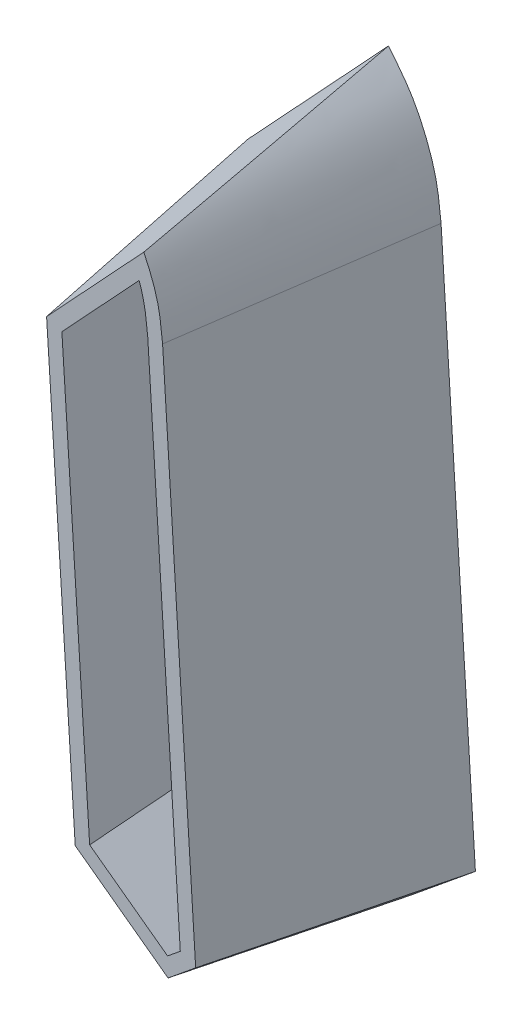
ISO-10303-21;
HEADER;
FILE_DESCRIPTION(('STEP AP214'),'2;1');
FILE_NAME('part.step','',(''),(''),'','','');
FILE_SCHEMA(('AUTOMOTIVE_DESIGN { 1 0 10303 214 1 1 1 1 }'));
ENDSEC;
DATA;
#1=APPLICATION_CONTEXT('core data for automotive mechanical design processes');
#2=APPLICATION_PROTOCOL_DEFINITION('international standard','automotive_design',2000,#1);
#3=PRODUCT_CONTEXT('',#1,'mechanical');
#4=PRODUCT('Part','Part','',(#3));
#5=PRODUCT_RELATED_PRODUCT_CATEGORY('part','',(#4));
#6=PRODUCT_DEFINITION_FORMATION('','',#4);
#7=PRODUCT_DEFINITION_CONTEXT('part definition',#1,'design');
#8=PRODUCT_DEFINITION('design','',#6,#7);
#9=PRODUCT_DEFINITION_SHAPE('','',#8);
#10=(LENGTH_UNIT() NAMED_UNIT(*) SI_UNIT(.MILLI.,.METRE.));
#11=(NAMED_UNIT(*) PLANE_ANGLE_UNIT() SI_UNIT($,.RADIAN.));
#12=(NAMED_UNIT(*) SI_UNIT($,.STERADIAN.) SOLID_ANGLE_UNIT());
#13=UNCERTAINTY_MEASURE_WITH_UNIT(LENGTH_MEASURE(1.E-05),#10,'distance_accuracy_value','');
#14=(GEOMETRIC_REPRESENTATION_CONTEXT(3) GLOBAL_UNCERTAINTY_ASSIGNED_CONTEXT((#13)) GLOBAL_UNIT_ASSIGNED_CONTEXT((#10,
#11,#12)) REPRESENTATION_CONTEXT('',''));
#15=CARTESIAN_POINT('',(0.,0.,0.));
#16=DIRECTION('',(0.,0.,1.));
#17=DIRECTION('',(1.,0.,0.));
#18=AXIS2_PLACEMENT_3D('',#15,#16,#17);
#19=CARTESIAN_POINT('',(3.87227801463903,18.4236879015267,14.6));
#20=DIRECTION('',(0.,0.,1.));
#21=DIRECTION('',(1.,0.,0.));
#22=AXIS2_PLACEMENT_3D('',#19,#20,#21);
#23=PLANE('',#22);
#24=DIRECTION('',(0.064382277997965,-0.997925308968458,0.));
#25=VECTOR('',#24,1.);
#26=CARTESIAN_POINT('',(-3.66355411317834,12.6296977708703,14.6));
#27=LINE('',#26,#25);
#28=CARTESIAN_POINT('',(-3.60200706317457,11.6757184958119,14.6));
#29=VERTEX_POINT('',#28);
#30=CARTESIAN_POINT('',(-1.91571842345979,-14.4617554197673,14.6));
#31=VERTEX_POINT('',#30);
#32=EDGE_CURVE('E436',#29,#31,#27,.T.);
#33=ORIENTED_EDGE('',*,*,#32,.F.);
#34=DIRECTION('',(-0.68139186174768,-0.731918800649383,0.));
#35=VECTOR('',#34,1.);
#36=CARTESIAN_POINT('',(3.18660885292075,18.9677275412879,14.6));
#37=LINE('',#36,#35);
#38=CARTESIAN_POINT('',(1.08544398610209,16.7107559576479,14.6));
#39=VERTEX_POINT('',#38);
#40=EDGE_CURVE('E459',#39,#29,#37,.T.);
#41=ORIENTED_EDGE('',*,*,#40,.F.);
#42=CARTESIAN_POINT('',(1.61023609440265,14.0146809414128,14.6));
#43=CARTESIAN_POINT('',(1.60071312676498,14.106316072458,14.6));
#44=CARTESIAN_POINT('',(1.59121125163537,14.1979552210391,14.6));
#45=CARTESIAN_POINT('',(1.57181162621345,14.3810119738376,14.6));
#46=CARTESIAN_POINT('',(1.56191467738446,14.4724296636665,14.6));
#47=CARTESIAN_POINT('',(1.54127376841198,14.6549898517129,14.6));
#48=CARTESIAN_POINT('',(1.53053150603807,14.7461325381527,14.6));
#49=CARTESIAN_POINT('',(1.50768052696685,14.9280793157177,14.6));
#50=CARTESIAN_POINT('',(1.49557434957431,15.0188837212538,14.6));
#51=CARTESIAN_POINT('',(1.46941341645522,15.200085398456,14.6));
#52=CARTESIAN_POINT('',(1.45536145648558,15.2904830654821,14.6));
#53=CARTESIAN_POINT('',(1.43236009956773,15.4258640302481,14.6));
#54=CARTESIAN_POINT('',(1.42436172237702,15.4710087934331,14.6));
#55=CARTESIAN_POINT('',(1.40750939628041,15.5611388636403,14.6));
#56=CARTESIAN_POINT('',(1.39865545765002,15.6061241725708,14.6));
#57=CARTESIAN_POINT('',(1.38007750028059,15.6959017382836,14.6));
#58=CARTESIAN_POINT('',(1.37035372146911,15.7406940447507,14.6));
#59=CARTESIAN_POINT('',(1.35002950680315,15.8300796558035,14.6));
#60=CARTESIAN_POINT('',(1.33942906500428,15.8746729590377,14.6));
#61=CARTESIAN_POINT('',(1.31733514430271,15.9636943205373,14.6));
#62=CARTESIAN_POINT('',(1.30584062155508,16.0081221202181,14.6));
#63=CARTESIAN_POINT('',(1.28193829721659,16.0967305869205,14.6));
#64=CARTESIAN_POINT('',(1.26953049689792,16.1409112542862,14.6));
#65=CARTESIAN_POINT('',(1.23108905171449,16.2733451786891,14.6));
#66=CARTESIAN_POINT('',(1.20389507601611,16.3612620596593,14.6));
#67=CARTESIAN_POINT('',(1.14668358142519,16.536520698584,14.6));
#68=CARTESIAN_POINT('',(1.1166563545105,16.6238592944872,14.6));
#69=CARTESIAN_POINT('',(1.08544398610209,16.7107559576479,14.6));
#70=B_SPLINE_CURVE_WITH_KNOTS('',3,(#42,#43,#44,#45,#46,#47,#48,#49,#50,#51,#52,#53,#54,#55,#56,
#57,#58,#59,#60,#61,#62,#63,#64,#65,#66,#67,#68,#69),.UNSPECIFIED.,.F.,.F.,(4,2,2,2,2,2,2,2,2,2,
2,2,2,4),(0.,0.276388968885837,0.552243209624812,0.827556898351419,1.10236623061239,
1.37678472873674,1.51432234685472,1.65185831331688,1.78935645959755,1.92685553828804,
2.06451762964606,2.20217952924483,2.47820933218736,2.75522189085504),.UNSPECIFIED.);
#71=CARTESIAN_POINT('',(1.61023609440265,14.0146809414128,14.6));
#72=VERTEX_POINT('',#71);
#73=EDGE_CURVE('E479',#72,#39,#70,.T.);
#74=ORIENTED_EDGE('',*,*,#73,.F.);
#75=DIRECTION('',(-0.0629956112398931,0.998013803994971,0.));
#76=VECTOR('',#75,1.);
#77=CARTESIAN_POINT('',(3.65870460275384,-18.438371075151,14.6));
#78=LINE('',#77,#76);
#79=CARTESIAN_POINT('',(3.58703567302214,-17.3029494198645,14.6));
#80=VERTEX_POINT('',#79);
#81=EDGE_CURVE('E487',#80,#72,#78,.T.);
#82=ORIENTED_EDGE('',*,*,#81,.F.);
#83=DIRECTION('',(0.773957299203321,0.633237790257262,0.));
#84=VECTOR('',#83,1.);
#85=CARTESIAN_POINT('',(1.4834286614798,-19.0240824293082,14.6));
#86=LINE('',#85,#84);
#87=CARTESIAN_POINT('',(2.81418728161062,-17.9352799219284,14.6));
#88=VERTEX_POINT('',#87);
#89=EDGE_CURVE('E815',#88,#80,#86,.T.);
#90=ORIENTED_EDGE('',*,*,#89,.F.);
#91=DIRECTION('',(0.806004429494522,-0.591909502910039,0.));
#92=VECTOR('',#91,1.);
#93=CARTESIAN_POINT('',(-2.74941625034012,-13.8495085781521,14.6));
#94=LINE('',#93,#92);
#95=EDGE_CURVE('E467',#31,#88,#94,.T.);
#96=ORIENTED_EDGE('',*,*,#95,.F.);
#97=EDGE_LOOP('',(#33,#41,#74,#82,#90,#96));
#98=FACE_BOUND('',#97,.T.);
#99=DIRECTION('',(0.68139186174768,0.731918800649383,0.));
#100=VECTOR('',#99,1.);
#101=CARTESIAN_POINT('',(2.57127209480842,19.6348807894148,14.6));
#102=LINE('',#101,#100);
#103=CARTESIAN_POINT('',(1.37023439181418,18.3447830872562,14.6));
#104=VERTEX_POINT('',#103);
#105=CARTESIAN_POINT('',(-4.53021776365667,12.0067974032997,14.6));
#106=VERTEX_POINT('',#105);
#107=EDGE_CURVE('E311',#104,#106,#102,.F.);
#108=ORIENTED_EDGE('',*,*,#107,.T.);
#109=DIRECTION('',(-0.064382277997965,0.997925308968458,0.));
#110=VECTOR('',#109,1.);
#111=CARTESIAN_POINT('',(-4.90766566808868,17.8572399219959,14.6));
#112=LINE('',#111,#110);
#113=CARTESIAN_POINT('',(-2.79163138895931,-14.9412914045093,14.6));
#114=VERTEX_POINT('',#113);
#115=EDGE_CURVE('E12',#106,#114,#112,.F.);
#116=ORIENTED_EDGE('',*,*,#115,.T.);
#117=DIRECTION('',(-0.806004429494522,0.591909502910039,0.));
#118=VECTOR('',#117,1.);
#119=CARTESIAN_POINT('',(-14.380288777606,-6.43087113472187,14.6));
#120=LINE('',#119,#118);
#121=CARTESIAN_POINT('',(2.84413205824944,-19.0800551860532,14.6));
#122=VERTEX_POINT('',#121);
#123=EDGE_CURVE('E199',#114,#122,#120,.F.);
#124=ORIENTED_EDGE('',*,*,#123,.T.);
#125=DIRECTION('',(-0.773957299203321,-0.633237790257262,0.));
#126=VECTOR('',#125,1.);
#127=CARTESIAN_POINT('',(21.8405490205937,-3.53753221686241,14.6));
#128=LINE('',#127,#126);
#129=CARTESIAN_POINT('',(4.51945745204866,-17.7093344093084,14.6));
#130=VERTEX_POINT('',#129);
#131=EDGE_CURVE('E821',#122,#130,#128,.F.);
#132=ORIENTED_EDGE('',*,*,#131,.T.);
#133=DIRECTION('',(0.062995611239893,-0.998013803994971,0.));
#134=VECTOR('',#133,1.);
#135=CARTESIAN_POINT('',(2.24518835101128,18.3209844043485,14.6));
#136=LINE('',#135,#134);
#137=CARTESIAN_POINT('',(2.51226233026394,14.0898401589662,14.6));
#138=VERTEX_POINT('',#137);
#139=EDGE_CURVE('E371',#130,#138,#136,.F.);
#140=ORIENTED_EDGE('',*,*,#139,.T.);
#141=CARTESIAN_POINT('',(2.51706792493701,14.0435144950325,14.6));
#142=CARTESIAN_POINT('',(2.50515186986557,14.1580651651376,14.6));
#143=CARTESIAN_POINT('',(2.49329247703641,14.2726258792983,14.6));
#144=CARTESIAN_POINT('',(2.46888953291516,14.5019561791502,14.6));
#145=CARTESIAN_POINT('',(2.45634438394057,14.6167255930305,14.6));
#146=CARTESIAN_POINT('',(2.42981079843857,14.8462085220989,14.6));
#147=CARTESIAN_POINT('',(2.41582103928684,14.9609218876986,14.6));
#148=CARTESIAN_POINT('',(2.38540102477533,15.1901955886822,14.6));
#149=CARTESIAN_POINT('',(2.36896743058682,15.304755494896,14.6));
#150=CARTESIAN_POINT('',(2.34172811727021,15.4761359156283,14.6));
#151=CARTESIAN_POINT('',(2.33222132132884,15.533162680889,14.6));
#152=CARTESIAN_POINT('',(2.31218610706565,15.6470367044503,14.6));
#153=CARTESIAN_POINT('',(2.30165770119421,15.7038839649298,14.6));
#154=CARTESIAN_POINT('',(2.27944530321414,15.8173202133363,14.6));
#155=CARTESIAN_POINT('',(2.26776197435318,15.8739093301981,14.6));
#156=CARTESIAN_POINT('',(2.24302433150095,15.9867874459897,14.6));
#157=CARTESIAN_POINT('',(2.22997001740809,16.0430764448972,14.6));
#158=CARTESIAN_POINT('',(2.19879585738584,16.1708234987215,14.6));
#159=CARTESIAN_POINT('',(2.18027198755842,16.2421830369884,14.6));
#160=CARTESIAN_POINT('',(2.14133155954117,16.384384118774,14.6));
#161=CARTESIAN_POINT('',(2.1209149027198,16.4552256350911,14.6));
#162=CARTESIAN_POINT('',(2.05705188579153,16.6670249880346,14.6));
#163=CARTESIAN_POINT('',(2.01100537619171,16.8072057914651,14.6));
#164=CARTESIAN_POINT('',(1.93769979178003,17.0158385751609,14.6));
#165=CARTESIAN_POINT('',(1.91257903865408,17.0850584953647,14.6));
#166=CARTESIAN_POINT('',(1.86103848686555,17.2230161327681,14.6));
#167=CARTESIAN_POINT('',(1.83461866771627,17.2917538423435,14.6));
#168=CARTESIAN_POINT('',(1.78059908969113,17.428795236173,14.6));
#169=CARTESIAN_POINT('',(1.75299885016974,17.4970987303665,14.6));
#170=CARTESIAN_POINT('',(1.69674284942329,17.6332682695026,14.6));
#171=CARTESIAN_POINT('',(1.66808709886712,17.7011343188586,14.6));
#172=CARTESIAN_POINT('',(1.59075132807518,17.8799255351254,14.6));
#173=CARTESIAN_POINT('',(1.54106589484465,17.9904194514132,14.6));
#174=CARTESIAN_POINT('',(1.43790642702302,18.2096351833521,14.6));
#175=CARTESIAN_POINT('',(1.38443235145378,18.3183569798202,14.6));
#176=CARTESIAN_POINT('',(1.27310543768194,18.5334266181351,14.6));
#177=CARTESIAN_POINT('',(1.21525638208929,18.6397764100765,14.6));
#178=CARTESIAN_POINT('',(1.09469826470812,18.8495706779165,14.6));
#179=CARTESIAN_POINT('',(1.03199394502238,18.9530178575006,14.6));
#180=CARTESIAN_POINT('',(0.900996317867633,19.1564831667151,14.6));
#181=CARTESIAN_POINT('',(0.832696095620921,19.2564968303913,14.6));
#182=CARTESIAN_POINT('',(0.692297078183861,19.4539315799896,14.6));
#183=CARTESIAN_POINT('',(0.620194664806909,19.5513500586543,14.6));
#184=CARTESIAN_POINT('',(0.473349392524603,19.7442887770781,14.6));
#185=CARTESIAN_POINT('',(0.398604459436016,19.8398074294114,14.6));
#186=CARTESIAN_POINT('',(0.247558334550347,20.0295570500392,14.6));
#187=CARTESIAN_POINT('',(0.171257548957128,20.1237883439759,14.6));
#188=CARTESIAN_POINT('',(0.0730233812226095,20.2440987049029,14.6));
#189=CARTESIAN_POINT('',(0.0514426639616871,20.2704673906331,14.6));
#190=CARTESIAN_POINT('',(0.00823909471218009,20.3231586276142,14.6));
#191=CARTESIAN_POINT('',(-0.0133837446531021,20.3494811892043,14.6));
#192=CARTESIAN_POINT('',(-0.0782458829553675,20.4283356712043,14.6));
#193=CARTESIAN_POINT('',(-0.121536757301503,20.4808252238813,14.6));
#194=CARTESIAN_POINT('',(-0.164843457964213,20.5333013140376,14.6));
#195=B_SPLINE_CURVE_WITH_KNOTS('',3,(#141,#142,#143,#144,#145,#146,#147,#148,#149,#150,#151,
#152,#153,#154,#155,#156,#157,#158,#159,#160,#161,#162,#163,#164,#165,#166,#167,#168,#169,#170,
#171,#172,#173,#174,#175,#176,#177,#178,#179,#180,#181,#182,#183,#184,#185,#186,#187,#188,#189,
#190,#191,#192,#193,#194),.UNSPECIFIED.,.F.,.F.,(4,2,2,2,2,2,2,2,2,2,2,2,2,2,2,2,2,2,2,2,2,2,2,
2,2,2,4),(0.,0.345513524648036,0.691869518593735,1.03854548142292,1.38569950866771,
1.55913325661909,1.73256489119701,1.90589749998887,2.07923012162375,2.30037315799642,
2.52152772443248,2.96399692925322,3.18490062737779,3.40580781034569,3.62680581538108,
3.84780158722746,4.21119248469657,4.57458731321939,4.93767146542055,5.30040536364695,
5.66359445010276,6.02713561544649,6.39096876162207,6.75470810413941,6.8569300471466,
6.95912501187838,7.16324037384047),.UNSPECIFIED.);
#196=EDGE_CURVE('E362',#138,#104,#195,.T.);
#197=ORIENTED_EDGE('',*,*,#196,.T.);
#198=EDGE_LOOP('',(#108,#116,#124,#132,#140,#197));
#199=FACE_BOUND('',#198,.T.);
#200=ADVANCED_FACE('F190',(#98,#199),#23,.T.);
#201=CARTESIAN_POINT('',(3.87539249217648,18.4158054949753,0.));
#202=DIRECTION('',(0.,0.,1.));
#203=DIRECTION('',(1.,0.,0.));
#204=AXIS2_PLACEMENT_3D('',#201,#202,#203);
#205=PLANE('',#204);
#206=DIRECTION('',(-0.68139186174768,-0.731918800649383,0.));
#207=VECTOR('',#206,1.);
#208=CARTESIAN_POINT('',(1.61860283110759,22.0052294456083,0.));
#209=LINE('',#208,#207);
#210=CARTESIAN_POINT('',(1.61860283110759,22.0052294456083,0.));
#211=VERTEX_POINT('',#210);
#212=CARTESIAN_POINT('',(-6.9020178309561,12.8527830988461,0.));
#213=VERTEX_POINT('',#212);
#214=EDGE_CURVE('E308',#211,#213,#209,.T.);
#215=ORIENTED_EDGE('',*,*,#214,.F.);
#216=CARTESIAN_POINT('',(4.8171445311525,14.2820531628694,0.));
#217=CARTESIAN_POINT('',(4.74365145263784,14.9907001597826,0.));
#218=CARTESIAN_POINT('',(4.6709877959634,15.699468232885,0.));
#219=CARTESIAN_POINT('',(4.44510836229876,16.745558019847,0.));
#220=CARTESIAN_POINT('',(4.35014492308384,17.0887509553164,0.));
#221=CARTESIAN_POINT('',(4.13222880477891,17.7606046441232,0.));
#222=CARTESIAN_POINT('',(4.00900621810086,18.0904281051886,0.));
#223=CARTESIAN_POINT('',(3.60816504032774,19.0665602745486,0.));
#224=CARTESIAN_POINT('',(3.30047745141903,19.7000033187042,0.));
#225=CARTESIAN_POINT('',(2.72213163531692,20.6001863302646,0.));
#226=CARTESIAN_POINT('',(2.510782441825,20.8897127338198,0.));
#227=CARTESIAN_POINT('',(2.07307494793187,21.4539344824473,0.));
#228=CARTESIAN_POINT('',(1.84599992817952,21.7297061369493,0.));
#229=CARTESIAN_POINT('',(1.61860283110759,22.0052294456083,0.));
#230=B_SPLINE_CURVE_WITH_KNOTS('',3,(#216,#217,#218,#219,#220,#221,#222,#223,#224,#225,#226,
#227,#228,#229),.UNSPECIFIED.,.F.,.F.,(4,2,2,2,2,2,4),(0.,0.249999999999999,0.374999999999999,
0.499999999999999,0.749999999999999,0.875,1.),.UNSPECIFIED.);
#231=CARTESIAN_POINT('',(4.8171445311525,14.2820531628694,0.));
#232=VERTEX_POINT('',#231);
#233=EDGE_CURVE('E319',#232,#211,#230,.T.);
#234=ORIENTED_EDGE('',*,*,#233,.F.);
#235=DIRECTION('',(-0.062995611239893,0.998013803994971,0.));
#236=VECTOR('',#235,1.);
#237=CARTESIAN_POINT('',(6.9020178309561,-18.7477451330933,0.));
#238=LINE('',#237,#236);
#239=CARTESIAN_POINT('',(6.9020178309561,-18.7477451330933,0.));
#240=VERTEX_POINT('',#239);
#241=EDGE_CURVE('E325',#240,#232,#238,.T.);
#242=ORIENTED_EDGE('',*,*,#241,.F.);
#243=DIRECTION('',(0.773957299203321,0.633237790257263,0.));
#244=VECTOR('',#243,1.);
#245=CARTESIAN_POINT('',(2.92064811566004,-22.0052294456083,0.));
#246=LINE('',#245,#244);
#247=CARTESIAN_POINT('',(2.92064811566004,-22.0052294456083,0.));
#248=VERTEX_POINT('',#247);
#249=EDGE_CURVE('E349',#248,#240,#246,.T.);
#250=ORIENTED_EDGE('',*,*,#249,.F.);
#251=DIRECTION('',(0.806004429494522,-0.591909502910039,0.));
#252=VECTOR('',#251,1.);
#253=CARTESIAN_POINT('',(-5.02546933728896,-16.1697994410989,0.));
#254=LINE('',#253,#252);
#255=CARTESIAN_POINT('',(-5.02546933728896,-16.1697994410989,0.));
#256=VERTEX_POINT('',#255);
#257=EDGE_CURVE('E345',#256,#248,#254,.T.);
#258=ORIENTED_EDGE('',*,*,#257,.F.);
#259=DIRECTION('',(0.0764088745643058,-0.99707656871868,0.));
#260=VECTOR('',#259,1.);
#261=CARTESIAN_POINT('',(-5.05155051671999,-15.8294602718137,0.));
#262=LINE('',#261,#260);
#263=CARTESIAN_POINT('',(-5.05155051671999,-15.8294602718137,0.));
#264=VERTEX_POINT('',#263);
#265=EDGE_CURVE('E336',#264,#256,#262,.T.);
#266=ORIENTED_EDGE('',*,*,#265,.F.);
#267=DIRECTION('',(0.064382277997965,-0.997925308968458,0.));
#268=VECTOR('',#267,1.);
#269=CARTESIAN_POINT('',(-6.9020178309561,12.8527830988461,0.));
#270=LINE('',#269,#268);
#271=EDGE_CURVE('E330',#213,#264,#270,.T.);
#272=ORIENTED_EDGE('',*,*,#271,.F.);
#273=EDGE_LOOP('',(#215,#234,#242,#250,#258,#266,#272));
#274=FACE_BOUND('',#273,.T.);
#275=DIRECTION('',(-0.68139186174768,-0.731918800649383,0.));
#276=VECTOR('',#275,1.);
#277=CARTESIAN_POINT('',(2.35052163175697,21.3238375838606,0.));
#278=LINE('',#277,#276);
#279=CARTESIAN_POINT('',(1.56366515846673,20.4786337025923,0.));
#280=VERTEX_POINT('',#279);
#281=CARTESIAN_POINT('',(-5.87633589483157,12.4869376559249,0.));
#282=VERTEX_POINT('',#281);
#283=EDGE_CURVE('E214',#280,#282,#278,.T.);
#284=ORIENTED_EDGE('',*,*,#283,.T.);
#285=DIRECTION('',(0.064382277997965,-0.997925308968458,0.));
#286=VECTOR('',#285,1.);
#287=CARTESIAN_POINT('',(-5.90409252198765,12.9171653768441,0.));
#288=LINE('',#287,#286);
#289=CARTESIAN_POINT('',(-4.06190582511666,-15.6367284246563,0.));
#290=VERTEX_POINT('',#289);
#291=EDGE_CURVE('E803',#282,#290,#288,.T.);
#292=ORIENTED_EDGE('',*,*,#291,.T.);
#293=DIRECTION('',(0.806004429494522,-0.591909502910039,0.));
#294=VECTOR('',#293,1.);
#295=CARTESIAN_POINT('',(-4.43355983437892,-15.3637950116043,0.));
#296=LINE('',#295,#294);
#297=CARTESIAN_POINT('',(2.88755884351119,-20.7402415406799,0.));
#298=VERTEX_POINT('',#297);
#299=EDGE_CURVE('E801',#290,#298,#296,.T.);
#300=ORIENTED_EDGE('',*,*,#299,.T.);
#301=DIRECTION('',(0.773957299203321,0.633237790257263,0.));
#302=VECTOR('',#301,1.);
#303=CARTESIAN_POINT('',(2.28741032540278,-21.231272146405,0.));
#304=LINE('',#303,#302);
#305=CARTESIAN_POINT('',(5.87168261170051,-18.2986857303432,0.));
#306=VERTEX_POINT('',#305);
#307=EDGE_CURVE('E778',#298,#306,#304,.T.);
#308=ORIENTED_EDGE('',*,*,#307,.T.);
#309=DIRECTION('',(-0.062995611239893,0.998013803994971,0.));
#310=VECTOR('',#309,1.);
#311=CARTESIAN_POINT('',(5.90400402696113,-18.8107407443332,0.));
#312=LINE('',#311,#310);
#313=CARTESIAN_POINT('',(3.82040008561638,14.1989476227119,0.));
#314=VERTEX_POINT('',#313);
#315=EDGE_CURVE('E793',#306,#314,#312,.T.);
#316=ORIENTED_EDGE('',*,*,#315,.T.);
#317=CARTESIAN_POINT('',(3.82040008561638,14.1989476227119,0.));
#318=CARTESIAN_POINT('',(3.76214796775195,14.7607027667106,0.));
#319=CARTESIAN_POINT('',(3.7049128716537,15.3226101346021,0.));
#320=CARTESIAN_POINT('',(3.55347880581369,16.1556552123493,0.));
#321=CARTESIAN_POINT('',(3.49023588310681,16.4322509478892,0.));
#322=CARTESIAN_POINT('',(3.33837307565681,16.9766335877023,0.));
#323=CARTESIAN_POINT('',(3.25085193640039,17.2446989813618,0.));
#324=CARTESIAN_POINT('',(3.05809943480658,17.7745249592178,0.));
#325=CARTESIAN_POINT('',(2.95314281756539,18.0363833522038,0.));
#326=CARTESIAN_POINT('',(2.72860719194208,18.5548945916611,0.));
#327=CARTESIAN_POINT('',(2.60822289993793,18.8110971957428,0.));
#328=CARTESIAN_POINT('',(2.34764087823596,19.3102691844403,0.));
#329=CARTESIAN_POINT('',(2.20721867572475,19.5537724077982,0.));
#330=CARTESIAN_POINT('',(1.90110045311865,20.0256044456607,0.));
#331=CARTESIAN_POINT('',(1.73565253247487,20.2540822191619,0.));
#332=CARTESIAN_POINT('',(1.56366515846673,20.4786337025923,0.));
#333=B_SPLINE_CURVE_WITH_KNOTS('',3,(#317,#318,#319,#320,#321,#322,#323,#324,#325,#326,#327,
#328,#329,#330,#331,#332),.UNSPECIFIED.,.F.,.F.,(4,2,2,2,2,2,2,4),(0.,0.249999999999998,
0.374999999999999,0.499999999999999,0.624999999999999,0.749999999999999,0.875,1.),.UNSPECIFIED.);
#334=EDGE_CURVE('E547',#314,#280,#333,.T.);
#335=ORIENTED_EDGE('',*,*,#334,.T.);
#336=EDGE_LOOP('',(#284,#292,#300,#308,#316,#335));
#337=FACE_BOUND('',#336,.T.);
#338=ADVANCED_FACE('F192',(#274,#337),#205,.F.);
#339=CARTESIAN_POINT('',(2.35052163175697,21.3238375838606,0.6));
#340=DIRECTION('',(0.731918800649383,-0.68139186174768,0.));
#341=DIRECTION('',(0.68139186174768,0.731918800649383,0.));
#342=AXIS2_PLACEMENT_3D('',#339,#340,#341);
#343=PLANE('',#342);
#344=ORIENTED_EDGE('',*,*,#283,.F.);
#345=DIRECTION('',(0.,0.,-1.));
#346=VECTOR('',#345,1.);
#347=CARTESIAN_POINT('',(1.56366515846673,20.4786337025923,0.6));
#348=LINE('',#347,#346);
#349=CARTESIAN_POINT('',(1.56366515846673,20.4786337025923,0.6));
#350=VERTEX_POINT('',#349);
#351=EDGE_CURVE('E541',#350,#280,#348,.T.);
#352=ORIENTED_EDGE('',*,*,#351,.F.);
#353=DIRECTION('',(-0.68139186174768,-0.731918800649383,0.));
#354=VECTOR('',#353,1.);
#355=CARTESIAN_POINT('',(2.35052163175697,21.3238375838606,0.6));
#356=LINE('',#355,#354);
#357=CARTESIAN_POINT('',(-5.87633589483157,12.4869376559249,0.6));
#358=VERTEX_POINT('',#357);
#359=EDGE_CURVE('E792',#350,#358,#356,.T.);
#360=ORIENTED_EDGE('',*,*,#359,.T.);
#361=DIRECTION('',(0.,0.,-1.));
#362=VECTOR('',#361,1.);
#363=CARTESIAN_POINT('',(-5.87633589483157,12.4869376559249,0.6));
#364=LINE('',#363,#362);
#365=EDGE_CURVE('E332',#358,#282,#364,.T.);
#366=ORIENTED_EDGE('',*,*,#365,.T.);
#367=EDGE_LOOP('',(#344,#352,#360,#366));
#368=FACE_BOUND('',#367,.T.);
#369=ADVANCED_FACE('F431',(#368),#343,.T.);
#370=CARTESIAN_POINT('',(-5.90409252198765,12.9171653768441,0.6));
#371=DIRECTION('',(0.997925308968458,0.064382277997965,0.));
#372=DIRECTION('',(-0.064382277997965,0.997925308968458,0.));
#373=AXIS2_PLACEMENT_3D('',#370,#371,#372);
#374=PLANE('',#373);
#375=ORIENTED_EDGE('',*,*,#291,.F.);
#376=ORIENTED_EDGE('',*,*,#365,.F.);
#377=DIRECTION('',(0.064382277997965,-0.997925308968458,0.));
#378=VECTOR('',#377,1.);
#379=CARTESIAN_POINT('',(-5.90409252198765,12.9171653768441,0.6));
#380=LINE('',#379,#378);
#381=CARTESIAN_POINT('',(-4.06190582511666,-15.6367284246563,0.6));
#382=VERTEX_POINT('',#381);
#383=EDGE_CURVE('E776',#358,#382,#380,.T.);
#384=ORIENTED_EDGE('',*,*,#383,.T.);
#385=DIRECTION('',(0.,0.,-1.));
#386=VECTOR('',#385,1.);
#387=CARTESIAN_POINT('',(-4.06190582511666,-15.6367284246563,0.6));
#388=LINE('',#387,#386);
#389=EDGE_CURVE('E338',#382,#290,#388,.T.);
#390=ORIENTED_EDGE('',*,*,#389,.T.);
#391=EDGE_LOOP('',(#375,#376,#384,#390));
#392=FACE_BOUND('',#391,.T.);
#393=ADVANCED_FACE('F586',(#392),#374,.T.);
#394=CARTESIAN_POINT('',(-4.43355983437892,-15.3637950116043,0.6));
#395=DIRECTION('',(0.591909502910039,0.806004429494522,0.));
#396=DIRECTION('',(-0.806004429494523,0.591909502910039,0.));
#397=AXIS2_PLACEMENT_3D('',#394,#395,#396);
#398=PLANE('',#397);
#399=ORIENTED_EDGE('',*,*,#299,.F.);
#400=ORIENTED_EDGE('',*,*,#389,.F.);
#401=DIRECTION('',(0.806004429494522,-0.591909502910039,0.));
#402=VECTOR('',#401,1.);
#403=CARTESIAN_POINT('',(-4.43355983437892,-15.3637950116043,0.6));
#404=LINE('',#403,#402);
#405=CARTESIAN_POINT('',(2.88755884351119,-20.7402415406799,0.6));
#406=VERTEX_POINT('',#405);
#407=EDGE_CURVE('E560',#382,#406,#404,.T.);
#408=ORIENTED_EDGE('',*,*,#407,.T.);
#409=DIRECTION('',(0.,0.,-1.));
#410=VECTOR('',#409,1.);
#411=CARTESIAN_POINT('',(2.88755884351119,-20.7402415406799,0.6));
#412=LINE('',#411,#410);
#413=EDGE_CURVE('E771',#406,#298,#412,.T.);
#414=ORIENTED_EDGE('',*,*,#413,.T.);
#415=EDGE_LOOP('',(#399,#400,#408,#414));
#416=FACE_BOUND('',#415,.T.);
#417=ADVANCED_FACE('F582',(#416),#398,.T.);
#418=CARTESIAN_POINT('',(2.28741032540278,-21.231272146405,0.6));
#419=DIRECTION('',(-0.633237790257263,0.773957299203321,0.));
#420=DIRECTION('',(-0.773957299203321,-0.633237790257263,0.));
#421=AXIS2_PLACEMENT_3D('',#418,#419,#420);
#422=PLANE('',#421);
#423=ORIENTED_EDGE('',*,*,#307,.F.);
#424=ORIENTED_EDGE('',*,*,#413,.F.);
#425=DIRECTION('',(0.773957299203321,0.633237790257263,0.));
#426=VECTOR('',#425,1.);
#427=CARTESIAN_POINT('',(2.28741032540278,-21.231272146405,0.6));
#428=LINE('',#427,#426);
#429=CARTESIAN_POINT('',(5.87168261170051,-18.2986857303432,0.6));
#430=VERTEX_POINT('',#429);
#431=EDGE_CURVE('E557',#406,#430,#428,.T.);
#432=ORIENTED_EDGE('',*,*,#431,.T.);
#433=DIRECTION('',(0.,0.,-1.));
#434=VECTOR('',#433,1.);
#435=CARTESIAN_POINT('',(5.87168261170051,-18.2986857303432,0.6));
#436=LINE('',#435,#434);
#437=EDGE_CURVE('E552',#430,#306,#436,.T.);
#438=ORIENTED_EDGE('',*,*,#437,.T.);
#439=EDGE_LOOP('',(#423,#424,#432,#438));
#440=FACE_BOUND('',#439,.T.);
#441=ADVANCED_FACE('F579',(#440),#422,.T.);
#442=CARTESIAN_POINT('',(5.90400402696113,-18.8107407443332,0.6));
#443=DIRECTION('',(-0.998013803994971,-0.062995611239893,0.));
#444=DIRECTION('',(0.062995611239893,-0.998013803994971,0.));
#445=AXIS2_PLACEMENT_3D('',#442,#443,#444);
#446=PLANE('',#445);
#447=ORIENTED_EDGE('',*,*,#315,.F.);
#448=ORIENTED_EDGE('',*,*,#437,.F.);
#449=DIRECTION('',(-0.062995611239893,0.998013803994971,0.));
#450=VECTOR('',#449,1.);
#451=CARTESIAN_POINT('',(5.90400402696113,-18.8107407443332,0.6));
#452=LINE('',#451,#450);
#453=CARTESIAN_POINT('',(3.82040008561638,14.1989476227119,0.6));
#454=VERTEX_POINT('',#453);
#455=EDGE_CURVE('E531',#430,#454,#452,.T.);
#456=ORIENTED_EDGE('',*,*,#455,.T.);
#457=DIRECTION('',(0.,0.,-1.));
#458=VECTOR('',#457,1.);
#459=CARTESIAN_POINT('',(3.82040008561638,14.1989476227119,0.6));
#460=LINE('',#459,#458);
#461=EDGE_CURVE('E544',#454,#314,#460,.T.);
#462=ORIENTED_EDGE('',*,*,#461,.T.);
#463=EDGE_LOOP('',(#447,#448,#456,#462));
#464=FACE_BOUND('',#463,.T.);
#465=ADVANCED_FACE('F555',(#464),#446,.T.);
#466=CARTESIAN_POINT('',(3.82040008561638,14.1989476227119,0.6));
#467=CARTESIAN_POINT('',(3.76214796775195,14.7607027667106,0.6));
#468=CARTESIAN_POINT('',(3.7049128716537,15.3226101346021,0.6));
#469=CARTESIAN_POINT('',(3.55347880581369,16.1556552123493,0.6));
#470=CARTESIAN_POINT('',(3.49023588310681,16.4322509478892,0.6));
#471=CARTESIAN_POINT('',(3.33837307565681,16.9766335877023,0.6));
#472=CARTESIAN_POINT('',(3.25085193640039,17.2446989813618,0.6));
#473=CARTESIAN_POINT('',(3.05809943480658,17.7745249592178,0.6));
#474=CARTESIAN_POINT('',(2.95314281756539,18.0363833522038,0.6));
#475=CARTESIAN_POINT('',(2.72860719194208,18.5548945916611,0.6));
#476=CARTESIAN_POINT('',(2.60822289993793,18.8110971957428,0.6));
#477=CARTESIAN_POINT('',(2.34764087823596,19.3102691844403,0.6));
#478=CARTESIAN_POINT('',(2.20721867572475,19.5537724077982,0.6));
#479=CARTESIAN_POINT('',(1.90110045311865,20.0256044456607,0.6));
#480=CARTESIAN_POINT('',(1.73565253247487,20.2540822191619,0.6));
#481=CARTESIAN_POINT('',(1.56366515846673,20.4786337025923,0.6));
#482=B_SPLINE_CURVE_WITH_KNOTS('',3,(#466,#467,#468,#469,#470,#471,#472,#473,#474,#475,#476,
#477,#478,#479,#480,#481),.UNSPECIFIED.,.F.,.F.,(4,2,2,2,2,2,2,4),(0.,0.249999999999998,
0.374999999999999,0.499999999999999,0.624999999999999,0.749999999999999,0.875,1.),.UNSPECIFIED.);
#483=DIRECTION('',(0.,0.,-1.));
#484=VECTOR('',#483,1.);
#485=SURFACE_OF_LINEAR_EXTRUSION('',#482,#484);
#486=ORIENTED_EDGE('',*,*,#334,.F.);
#487=ORIENTED_EDGE('',*,*,#461,.F.);
#488=EDGE_CURVE('E536',#454,#350,#482,.T.);
#489=ORIENTED_EDGE('',*,*,#488,.T.);
#490=ORIENTED_EDGE('',*,*,#351,.T.);
#491=EDGE_LOOP('',(#486,#487,#489,#490));
#492=FACE_BOUND('',#491,.T.);
#493=ADVANCED_FACE('F545',(#492),#485,.T.);
#494=CARTESIAN_POINT('',(1.56366515846673,20.4786337025923,0.6));
#495=DIRECTION('',(0.722907665663772,-0.673002797224597,-0.156434465040231));
#496=DIRECTION('',(0.68139186174768,0.731918800649383,0.));
#497=AXIS2_PLACEMENT_3D('',#494,#495,#496);
#498=PLANE('',#497);
#499=ORIENTED_EDGE('',*,*,#359,.F.);
#500=CARTESIAN_POINT('',(1.08544398610209,16.7107559576479,14.6));
#501=CARTESIAN_POINT('',(1.10087088934668,16.7859523684928,14.3477846827612));
#502=CARTESIAN_POINT('',(1.11585386034303,16.8607086087449,14.0954115615188));
#503=CARTESIAN_POINT('',(1.14500894062489,17.0094158602614,13.590382409604));
#504=CARTESIAN_POINT('',(1.15918105312233,17.0833668747145,13.3377263800564));
#505=CARTESIAN_POINT('',(1.18679180754325,17.2305408064505,12.8321572160565));
#506=CARTESIAN_POINT('',(1.2002304352573,17.3037637096055,12.5792440767199));
#507=CARTESIAN_POINT('',(1.22645183013412,17.4495567163165,12.073195400355));
#508=CARTESIAN_POINT('',(1.23923459620248,17.5221268187831,11.8200598629562));
#509=CARTESIAN_POINT('',(1.26416223634578,17.6666135521813,11.3136523166909));
#510=CARTESIAN_POINT('',(1.27630729872249,17.7385303707689,11.0603803706741));
#511=CARTESIAN_POINT('',(1.29987207876882,17.8816401462357,10.5535987030678));
#512=CARTESIAN_POINT('',(1.31129179735116,17.9528331040257,10.3000889817779));
#513=CARTESIAN_POINT('',(1.34444058325964,18.1653014505715,9.53920626916271));
#514=CARTESIAN_POINT('',(1.3650595439477,18.3054678312697,9.03147441143645));
#515=CARTESIAN_POINT('',(1.40873285582107,18.6233010002229,7.86593304706253));
#516=CARTESIAN_POINT('',(1.43072711288866,18.7999058495379,7.2077932916626));
#517=CARTESIAN_POINT('',(1.45976118200896,19.0608341715873,6.21941429575465));
#518=CARTESIAN_POINT('',(1.46877973455098,19.1471481054778,5.88975587829088));
#519=CARTESIAN_POINT('',(1.48550654650121,19.3184559383831,5.23006295113256));
#520=CARTESIAN_POINT('',(1.49321480706743,19.4034498385645,4.90002844177067));
#521=CARTESIAN_POINT('',(1.50742792999916,19.5722520658182,4.23949883550674));
#522=CARTESIAN_POINT('',(1.51393233864739,19.6560599349442,3.90900361205646));
#523=CARTESIAN_POINT('',(1.52599557660007,19.8227201083525,3.24775447060669));
#524=CARTESIAN_POINT('',(1.531554403115,19.9055724098152,2.91700055184693));
#525=CARTESIAN_POINT('',(1.5418956753339,20.0704883163416,2.25529802093265));
#526=CARTESIAN_POINT('',(1.54667815129189,20.1525519520219,1.92434941686959));
#527=CARTESIAN_POINT('',(1.55561035070163,20.316037664546,1.2622882375524));
#528=CARTESIAN_POINT('',(1.55976007970876,20.3974597470164,0.931175663763481));
#529=CARTESIAN_POINT('',(1.56366515846673,20.4786337025923,0.6));
#530=B_SPLINE_CURVE_WITH_KNOTS('',3,(#500,#501,#502,#503,#504,#505,#506,#507,#508,#509,#510,
#511,#512,#513,#514,#515,#516,#517,#518,#519,#520,#521,#522,#523,#524,#525,#526,#527,#528,#529),
.UNSPECIFIED.,.F.,.F.,(4,2,2,2,2,2,2,2,2,2,2,2,2,2,4),(0.,0.790912747258159,1.58182236136663,
2.37274729192352,3.16367354220674,3.95436491826511,4.74505529936148,6.32641945240888,
8.3717041594151,9.39437040961802,10.4170357560004,11.4400857512373,12.4631387644686,
13.4861519002192,14.50915605363),.UNSPECIFIED.);
#531=EDGE_CURVE('E486',#39,#350,#530,.T.);
#532=ORIENTED_EDGE('',*,*,#531,.F.);
#533=ORIENTED_EDGE('',*,*,#40,.T.);
#534=DIRECTION('',(-0.160088339323754,0.057101122037612,-0.985449737670374));
#535=VECTOR('',#534,1.);
#536=CARTESIAN_POINT('',(-5.87633589483157,12.4869376559249,0.6));
#537=LINE('',#536,#535);
#538=EDGE_CURVE('E512',#29,#358,#537,.T.);
#539=ORIENTED_EDGE('',*,*,#538,.T.);
#540=EDGE_LOOP('',(#499,#532,#533,#539));
#541=FACE_BOUND('',#540,.T.);
#542=ADVANCED_FACE('F495',(#541),#498,.T.);
#543=CARTESIAN_POINT('',(-5.87633589483157,12.4869376559249,0.6));
#544=DIRECTION('',(0.985639192452947,0.0635896253195449,-0.156434465040231));
#545=DIRECTION('',(-0.156751709848217,0.,-0.987638041723617));
#546=AXIS2_PLACEMENT_3D('',#543,#544,#545);
#547=PLANE('',#546);
#548=ORIENTED_EDGE('',*,*,#383,.F.);
#549=ORIENTED_EDGE('',*,*,#538,.F.);
#550=ORIENTED_EDGE('',*,*,#32,.T.);
#551=DIRECTION('',(-0.151010196847152,-0.0826735375584607,-0.985069036482091));
#552=VECTOR('',#551,1.);
#553=CARTESIAN_POINT('',(-4.06190582511666,-15.6367284246563,0.6));
#554=LINE('',#553,#552);
#555=EDGE_CURVE('E515',#31,#382,#554,.T.);
#556=ORIENTED_EDGE('',*,*,#555,.T.);
#557=EDGE_LOOP('',(#548,#549,#550,#556));
#558=FACE_BOUND('',#557,.T.);
#559=ADVANCED_FACE('F621',(#558),#547,.T.);
#560=CARTESIAN_POINT('',(-4.06190582511666,-15.6367284246563,0.6));
#561=DIRECTION('',(0.584622114711709,0.796081177479775,-0.156434465040231));
#562=DIRECTION('',(-0.806004429494522,0.591909502910039,0.));
#563=AXIS2_PLACEMENT_3D('',#560,#561,#562);
#564=PLANE('',#563);
#565=ORIENTED_EDGE('',*,*,#407,.F.);
#566=ORIENTED_EDGE('',*,*,#555,.F.);
#567=ORIENTED_EDGE('',*,*,#95,.T.);
#568=DIRECTION('',(0.00513863418563244,-0.196447660239741,-0.980500847131219));
#569=VECTOR('',#568,1.);
#570=CARTESIAN_POINT('',(2.88755884351119,-20.7402415406799,0.6));
#571=LINE('',#570,#569);
#572=EDGE_CURVE('E518',#88,#406,#571,.T.);
#573=ORIENTED_EDGE('',*,*,#572,.T.);
#574=EDGE_LOOP('',(#565,#566,#567,#573));
#575=FACE_BOUND('',#574,.T.);
#576=ADVANCED_FACE('F627',(#575),#564,.T.);
#577=CARTESIAN_POINT('',(2.88755884351119,-20.7402415406799,0.6));
#578=DIRECTION('',(-0.625441582261327,0.764428600541623,-0.156434465040231));
#579=DIRECTION('',(-0.773957299203321,-0.633237790257262,0.));
#580=AXIS2_PLACEMENT_3D('',#577,#578,#579);
#581=PLANE('',#580);
#582=ORIENTED_EDGE('',*,*,#431,.F.);
#583=ORIENTED_EDGE('',*,*,#572,.F.);
#584=ORIENTED_EDGE('',*,*,#89,.T.);
#585=DIRECTION('',(0.160663268082627,-0.0700231826115741,-0.984522253778936));
#586=VECTOR('',#585,1.);
#587=CARTESIAN_POINT('',(5.87168261170051,-18.2986857303432,0.6));
#588=LINE('',#587,#586);
#589=EDGE_CURVE('E520',#80,#430,#588,.T.);
#590=ORIENTED_EDGE('',*,*,#589,.T.);
#591=EDGE_LOOP('',(#582,#583,#584,#590));
#592=FACE_BOUND('',#591,.T.);
#593=ADVANCED_FACE('F575',(#592),#581,.T.);
#594=CARTESIAN_POINT('',(5.87168261170051,-18.2986857303432,0.6));
#595=DIRECTION('',(-0.985726597958834,-0.0622200307303064,-0.156434465040231));
#596=DIRECTION('',(-0.156738151972736,0.,0.987640193449098));
#597=AXIS2_PLACEMENT_3D('',#594,#595,#596);
#598=PLANE('',#597);
#599=ORIENTED_EDGE('',*,*,#455,.F.);
#600=ORIENTED_EDGE('',*,*,#589,.F.);
#601=ORIENTED_EDGE('',*,*,#81,.T.);
#602=CARTESIAN_POINT('',(1.61023609440265,14.0146809414128,14.6));
#603=CARTESIAN_POINT('',(1.93899270332679,14.0420932348565,12.5175322565398));
#604=CARTESIAN_POINT('',(2.26774939880745,14.0695041676904,10.4350645088358));
#605=CARTESIAN_POINT('',(3.00447068247931,14.1309271293968,5.76839784446033));
#606=CARTESIAN_POINT('',(3.41243531740323,14.1649384236627,3.18419892549766));
#607=CARTESIAN_POINT('',(3.82040008561638,14.1989476227119,0.6));
#608=B_SPLINE_CURVE_WITH_KNOTS('',3,(#602,#603,#604,#605,#606,#607),.UNSPECIFIED.,.F.,.F.,(4,2,
4),(0.,6.32530933619897,14.174582148268),.UNSPECIFIED.);
#609=EDGE_CURVE('E471',#72,#454,#608,.T.);
#610=ORIENTED_EDGE('',*,*,#609,.T.);
#611=EDGE_LOOP('',(#599,#600,#601,#610));
#612=FACE_BOUND('',#611,.T.);
#613=ADVANCED_FACE('F493',(#612),#598,.T.);
#614=CARTESIAN_POINT('',(1.17373323301012,13.9244971773659,17.4));
#615=CARTESIAN_POINT('',(1.1444409187202,14.2069780870474,17.4));
#616=CARTESIAN_POINT('',(1.11705619210871,14.4718409285799,17.4));
#617=CARTESIAN_POINT('',(1.07190879289523,14.8415168696055,17.4));
#618=CARTESIAN_POINT('',(1.05621492432718,14.96014007898,17.4));
#619=CARTESIAN_POINT('',(1.03113578824894,15.1310926585899,17.4));
#620=CARTESIAN_POINT('',(1.0225217015367,15.1869139901698,17.4));
#621=CARTESIAN_POINT('',(1.00916474375607,15.2689027783222,17.4));
#622=CARTESIAN_POINT('',(1.00463990071829,15.2959419341101,17.4));
#623=CARTESIAN_POINT('',(0.995437415931364,15.3494408453543,17.4));
#624=CARTESIAN_POINT('',(0.990640155980337,15.3765589678325,17.4));
#625=CARTESIAN_POINT('',(0.981364363214597,15.4275848259192,17.4));
#626=CARTESIAN_POINT('',(0.976825708233541,15.4517546794109,17.4));
#627=CARTESIAN_POINT('',(0.967228379319577,15.5013540066628,17.4));
#628=CARTESIAN_POINT('',(0.962289905294322,15.5261225869105,17.4));
#629=CARTESIAN_POINT('',(0.947059628239061,15.6003058414136,17.4));
#630=CARTESIAN_POINT('',(0.936352790119882,15.649597982227,17.4));
#631=CARTESIAN_POINT('',(0.913861115501079,15.747700913575,17.4));
#632=CARTESIAN_POINT('',(0.902076271172658,15.7965117075422,17.4));
#633=CARTESIAN_POINT('',(0.877463035514834,15.893499005277,17.4));
#634=CARTESIAN_POINT('',(0.86487395142376,15.9408173604848,17.4));
#635=CARTESIAN_POINT('',(0.837735487484489,16.0381011527887,17.4));
#636=CARTESIAN_POINT('',(0.823021311277908,16.0887702358272,17.4));
#637=CARTESIAN_POINT('',(0.792744113710824,16.189077219272,17.4));
#638=CARTESIAN_POINT('',(0.776942538611506,16.2395698760162,17.4));
#639=CARTESIAN_POINT('',(0.72757050813451,16.392118620566,17.4));
#640=CARTESIAN_POINT('',(0.692186296850625,16.4948181589921,17.4));
#641=CARTESIAN_POINT('',(0.615718625688717,16.7050079908857,17.4));
#642=CARTESIAN_POINT('',(0.575094563569927,16.8113656273076,17.4));
#643=CARTESIAN_POINT('',(0.511359410913564,16.9709307241792,17.4));
#644=CARTESIAN_POINT('',(0.489608671675257,17.0242317348518,17.4));
#645=CARTESIAN_POINT('',(0.445110950578862,17.131069850078,17.4));
#646=CARTESIAN_POINT('',(0.422076951919451,17.1852699564084,17.4));
#647=CARTESIAN_POINT('',(0.376177392781465,17.2912635597876,17.4));
#648=CARTESIAN_POINT('',(0.353621175089995,17.3422511672001,17.4));
#649=CARTESIAN_POINT('',(0.307593773502556,17.4440422979981,17.4));
#650=CARTESIAN_POINT('',(0.284408118367458,17.4941866091942,17.4));
#651=CARTESIAN_POINT('',(0.214363830253753,17.6421867125262,17.4));
#652=CARTESIAN_POINT('',(0.167048951887161,17.7375397189686,17.4));
#653=CARTESIAN_POINT('',(0.0233070824282816,18.0128922758555,17.4));
#654=CARTESIAN_POINT('',(-0.0750660161297946,18.1827116625623,17.4));
#655=CARTESIAN_POINT('',(-0.281048710190087,18.5002010955878,17.4));
#656=CARTESIAN_POINT('',(-0.406060015040176,18.6743501860872,17.4));
#657=CARTESIAN_POINT('',(-0.548775504735544,18.8606834808348,17.4));
#658=CARTESIAN_POINT('',(3.82040008561638,14.1989476227119,0.6));
#659=CARTESIAN_POINT('',(3.79127403191255,14.4798251951636,0.6));
#660=CARTESIAN_POINT('',(3.76240222579442,14.7607408230732,0.600000000000015));
#661=CARTESIAN_POINT('',(3.71108753052661,15.1809158096666,0.599999999999992));
#662=CARTESIAN_POINT('',(3.69264813831789,15.3207743966517,0.6));
#663=CARTESIAN_POINT('',(3.66193875145583,15.5301057202149,0.6));
#664=CARTESIAN_POINT('',(3.65119390900474,15.5998067356886,0.6));
#665=CARTESIAN_POINT('',(3.63418300095653,15.7042245016583,0.6));
#666=CARTESIAN_POINT('',(3.62836375900895,15.7390081309939,0.6));
#667=CARTESIAN_POINT('',(3.61640554796952,15.8085275341402,0.6));
#668=CARTESIAN_POINT('',(3.61026671609195,15.8432632677132,0.6));
#669=CARTESIAN_POINT('',(3.59764693942876,15.9126837718207,0.6));
#670=CARTESIAN_POINT('',(3.59113787069488,15.9473769750262,0.6));
#671=CARTESIAN_POINT('',(3.57772085743418,16.0167165627429,0.6));
#672=CARTESIAN_POINT('',(3.57081304847347,16.0513629077352,0.6));
#673=CARTESIAN_POINT('',(3.5494921624519,16.155212148558,0.6));
#674=CARTESIAN_POINT('',(3.53448162617194,16.2243252536956,0.600000000000004));
#675=CARTESIAN_POINT('',(3.50286971730397,16.3622083133739,0.599999999999996));
#676=CARTESIAN_POINT('',(3.48626834466286,16.4309782702187,0.6));
#677=CARTESIAN_POINT('',(3.45147715118952,16.5680713314814,0.6));
#678=CARTESIAN_POINT('',(3.43328716814135,16.636394396892,0.6));
#679=CARTESIAN_POINT('',(3.39532179062226,16.7724901386994,0.6));
#680=CARTESIAN_POINT('',(3.37561441873072,16.8402800572454,0.6));
#681=CARTESIAN_POINT('',(3.33483674062083,16.9753746584106,0.6));
#682=CARTESIAN_POINT('',(3.31376627064089,17.0426792995366,0.6));
#683=CARTESIAN_POINT('',(3.24863815915205,17.243910880406,0.6));
#684=CARTESIAN_POINT('',(3.20266372931701,17.3771554467459,0.6));
#685=CARTESIAN_POINT('',(3.10628764188996,17.6420684938337,0.6));
#686=CARTESIAN_POINT('',(3.05595434290012,17.7737613101271,0.6));
#687=CARTESIAN_POINT('',(2.97747484995115,17.9702398217778,0.6));
#688=CARTESIAN_POINT('',(2.95081840721232,18.0355558660494,0.6));
#689=CARTESIAN_POINT('',(2.8965519615839,18.1658484887922,0.6));
#690=CARTESIAN_POINT('',(2.86894207675189,18.2308251335837,0.6));
#691=CARTESIAN_POINT('',(2.81280793275558,18.3604528102813,0.6));
#692=CARTESIAN_POINT('',(2.78423381860593,18.425075968732,0.6));
#693=CARTESIAN_POINT('',(2.72601484699767,18.5538291615432,0.6));
#694=CARTESIAN_POINT('',(2.69637010937228,18.6179592645529,0.6));
#695=CARTESIAN_POINT('',(2.6057462198107,18.8094430424827,0.6));
#696=CARTESIAN_POINT('',(2.54307746145446,18.9358900355018,0.6));
#697=CARTESIAN_POINT('',(2.3476407443519,19.3102694992712,0.6));
#698=CARTESIAN_POINT('',(2.20721852790305,19.553772319046,0.6));
#699=CARTESIAN_POINT('',(1.90110060094035,20.0256045344129,0.6));
#700=CARTESIAN_POINT('',(1.73565252858828,20.2540822345608,0.6));
#701=CARTESIAN_POINT('',(1.56366515846673,20.4786337025923,0.6));
#702=B_SPLINE_SURFACE_WITH_KNOTS('',1,3,((#614,#615,#616,#617,#618,#619,#620,#621,#622,#623,
#624,#625,#626,#627,#628,#629,#630,#631,#632,#633,#634,#635,#636,#637,#638,#639,#640,#641,#642,
#643,#644,#645,#646,#647,#648,#649,#650,#651,#652,#653,#654,#655,#656,#657),(#658,#659,#660,
#661,#662,#663,#664,#665,#666,#667,#668,#669,#670,#671,#672,#673,#674,#675,#676,#677,#678,#679,
#680,#681,#682,#683,#684,#685,#686,#687,#688,#689,#690,#691,#692,#693,#694,#695,#696,#697,#698,
#699,#700,#701)),.UNSPECIFIED.,.F.,.F.,.F.,(2,2),(4,2,2,2,2,2,2,2,2,2,2,2,2,2,2,2,2,2,2,2,2,4),
(0.,1.),(0.,0.125,0.1875,0.21875,0.234375,0.25,0.265625,0.28125,0.3125,0.34375,0.375,0.40625,
0.4375,0.5,0.5625,0.59375,0.625,0.65625,0.6875,0.75,0.875,1.),.UNSPECIFIED.);
#703=ORIENTED_EDGE('',*,*,#488,.F.);
#704=ORIENTED_EDGE('',*,*,#609,.F.);
#705=ORIENTED_EDGE('',*,*,#73,.T.);
#706=ORIENTED_EDGE('',*,*,#531,.T.);
#707=EDGE_LOOP('',(#703,#704,#705,#706));
#708=FACE_BOUND('',#707,.T.);
#709=ADVANCED_FACE('F411',(#708),#702,.F.);
#710=CARTESIAN_POINT('',(-5.05155051671999,-15.8294602718137,0.));
#711=DIRECTION('',(0.985639192452947,0.0635896253195449,-0.156434465040231));
#712=DIRECTION('',(-0.156751709848217,0.,-0.987638041723617));
#713=AXIS2_PLACEMENT_3D('',#710,#711,#712);
#714=PLANE('',#713);
#715=DIRECTION('',(-0.160088339323754,0.0571011220376119,-0.985449737670374));
#716=VECTOR('',#715,1.);
#717=CARTESIAN_POINT('',(-6.59240273742864,12.742348014599,1.90588592513533));
#718=LINE('',#717,#716);
#719=EDGE_CURVE('E206',#106,#213,#718,.T.);
#720=ORIENTED_EDGE('',*,*,#719,.T.);
#721=ORIENTED_EDGE('',*,*,#271,.T.);
#722=DIRECTION('',(-0.156049127159232,-0.0110126896193989,-0.987687901404178));
#723=VECTOR('',#722,1.);
#724=CARTESIAN_POINT('',(-5.05150028518495,-15.8294567268768,0.000317932437868352));
#725=LINE('',#724,#723);
#726=CARTESIAN_POINT('',(-4.31959344685648,-15.7778046414884,4.6328047802135));
#727=VERTEX_POINT('',#726);
#728=EDGE_CURVE('E451',#727,#264,#725,.T.);
#729=ORIENTED_EDGE('',*,*,#728,.F.);
#730=DIRECTION('',(-0.151010196847152,-0.0826735375584607,-0.985069036482091));
#731=VECTOR('',#730,1.);
#732=CARTESIAN_POINT('',(-4.92138802943484,-16.1072690621965,0.707181067394782));
#733=LINE('',#732,#731);
#734=EDGE_CURVE('E402',#114,#727,#733,.T.);
#735=ORIENTED_EDGE('',*,*,#734,.F.);
#736=ORIENTED_EDGE('',*,*,#115,.F.);
#737=EDGE_LOOP('',(#720,#721,#729,#735,#736));
#738=FACE_BOUND('',#737,.T.);
#739=ADVANCED_FACE('F407',(#738),#714,.F.);
#740=CARTESIAN_POINT('',(-5.02546933728896,-16.1697994410989,0.));
#741=DIRECTION('',(0.984800901604047,0.0754681545251613,-0.156434465040231));
#742=DIRECTION('',(-0.156881858767138,0.,-0.987617376512669));
#743=AXIS2_PLACEMENT_3D('',#740,#741,#742);
#744=PLANE('',#743);
#745=ORIENTED_EDGE('',*,*,#265,.T.);
#746=DIRECTION('',(-0.150102122172023,-0.0833563691570262,-0.985150277186386));
#747=VECTOR('',#746,1.);
#748=CARTESIAN_POINT('',(-4.91945088223611,-16.1109241011039,0.695820344648322));
#749=LINE('',#748,#747);
#750=EDGE_CURVE('E446',#727,#256,#749,.T.);
#751=ORIENTED_EDGE('',*,*,#750,.F.);
#752=ORIENTED_EDGE('',*,*,#728,.T.);
#753=EDGE_LOOP('',(#745,#751,#752));
#754=FACE_BOUND('',#753,.T.);
#755=ADVANCED_FACE('F410',(#754),#744,.F.);
#756=CARTESIAN_POINT('',(2.92064811566004,-22.0052294456083,0.));
#757=DIRECTION('',(0.584622114711709,0.796081177479776,-0.156434465040231));
#758=DIRECTION('',(-0.806004429494522,0.591909502910039,0.));
#759=AXIS2_PLACEMENT_3D('',#756,#757,#758);
#760=PLANE('',#759);
#761=ORIENTED_EDGE('',*,*,#734,.T.);
#762=ORIENTED_EDGE('',*,*,#750,.T.);
#763=ORIENTED_EDGE('',*,*,#257,.T.);
#764=DIRECTION('',(0.0051386341856325,-0.196447660239741,-0.980500847131219));
#765=VECTOR('',#764,1.);
#766=CARTESIAN_POINT('',(2.91746490459977,-21.8835367268335,0.6073872995116));
#767=LINE('',#766,#765);
#768=EDGE_CURVE('E444',#122,#248,#767,.T.);
#769=ORIENTED_EDGE('',*,*,#768,.F.);
#770=ORIENTED_EDGE('',*,*,#123,.F.);
#771=EDGE_LOOP('',(#761,#762,#763,#769,#770));
#772=FACE_BOUND('',#771,.T.);
#773=ADVANCED_FACE('F415',(#772),#760,.F.);
#774=CARTESIAN_POINT('',(6.9020178309561,-18.7477451330933,0.));
#775=DIRECTION('',(-0.625441582261328,0.764428600541623,-0.156434465040231));
#776=DIRECTION('',(-0.773957299203321,-0.633237790257262,0.));
#777=AXIS2_PLACEMENT_3D('',#774,#775,#776);
#778=PLANE('',#777);
#779=ORIENTED_EDGE('',*,*,#768,.T.);
#780=ORIENTED_EDGE('',*,*,#249,.T.);
#781=DIRECTION('',(0.160663268082627,-0.0700231826115741,-0.984522253778936));
#782=VECTOR('',#781,1.);
#783=CARTESIAN_POINT('',(6.47661135544417,-18.5623367589552,2.60683196004561));
#784=LINE('',#783,#782);
#785=EDGE_CURVE('E442',#130,#240,#784,.T.);
#786=ORIENTED_EDGE('',*,*,#785,.F.);
#787=ORIENTED_EDGE('',*,*,#131,.F.);
#788=EDGE_LOOP('',(#779,#780,#786,#787));
#789=FACE_BOUND('',#788,.T.);
#790=ADVANCED_FACE('F418',(#789),#778,.F.);
#791=CARTESIAN_POINT('',(4.8171445311525,14.2820531628694,0.));
#792=DIRECTION('',(-0.985726597958834,-0.0622200307303063,-0.156434465040231));
#793=DIRECTION('',(-0.156738151972736,0.,0.987640193449098));
#794=AXIS2_PLACEMENT_3D('',#791,#792,#793);
#795=PLANE('',#794);
#796=ORIENTED_EDGE('',*,*,#785,.T.);
#797=ORIENTED_EDGE('',*,*,#241,.T.);
#798=CARTESIAN_POINT('',(2.29124682936152,14.0713992607193,16.));
#799=CARTESIAN_POINT('',(2.63653371093323,14.1002072029297,13.8128164145087));
#800=CARTESIAN_POINT('',(2.98182089955707,14.1290103185397,11.6256328139426));
#801=CARTESIAN_POINT('',(3.82378647187468,14.1992334461979,6.29229949672626));
#802=CARTESIAN_POINT('',(4.32046518384783,14.2406482979713,3.14614976395905));
#803=CARTESIAN_POINT('',(4.8171445311525,14.2820531628694,0.));
#804=B_SPLINE_CURVE_WITH_KNOTS('',3,(#798,#799,#800,#801,#802,#803),.UNSPECIFIED.,.F.,.F.,(4,2,
4),(0.,6.64337449509946,16.1995226555663),.UNSPECIFIED.);
#805=EDGE_CURVE('E315',#138,#232,#804,.T.);
#806=ORIENTED_EDGE('',*,*,#805,.F.);
#807=ORIENTED_EDGE('',*,*,#139,.F.);
#808=EDGE_LOOP('',(#796,#797,#806,#807));
#809=FACE_BOUND('',#808,.T.);
#810=ADVANCED_FACE('F381',(#809),#795,.F.);
#811=CARTESIAN_POINT('',(-0.726751192877247,20.0695431355975,19.2));
#812=CARTESIAN_POINT('',(-0.500943000831678,19.7959450159677,19.2));
#813=CARTESIAN_POINT('',(-0.293370236127309,19.5431728670993,19.2));
#814=CARTESIAN_POINT('',(0.071749963390867,19.0725188250745,19.2));
#815=CARTESIAN_POINT('',(0.228496678289881,18.8555570652792,19.2));
#816=CARTESIAN_POINT('',(0.484427153759901,18.4572069473883,19.2));
#817=CARTESIAN_POINT('',(0.606648342502535,18.2411903836366,19.2));
#818=CARTESIAN_POINT('',(0.840573670349916,17.7767651675737,19.2));
#819=CARTESIAN_POINT('',(0.953158483991687,17.5265653816191,19.2));
#820=CARTESIAN_POINT('',(1.17154836464382,16.9947398352483,19.2));
#821=CARTESIAN_POINT('',(1.26705762341293,16.7377258652309,19.2));
#822=CARTESIAN_POINT('',(1.38930874595859,16.3608152722659,19.2));
#823=CARTESIAN_POINT('',(1.4264233802725,16.2369467104812,19.2));
#824=CARTESIAN_POINT('',(1.49304584463381,15.9928382933067,19.2));
#825=CARTESIAN_POINT('',(1.5222815785764,15.8737869650089,19.2));
#826=CARTESIAN_POINT('',(1.57357067277623,15.6362582028364,19.2));
#827=CARTESIAN_POINT('',(1.59772104136789,15.5083311971587,19.2));
#828=CARTESIAN_POINT('',(1.64228090625956,15.239794318593,19.2));
#829=CARTESIAN_POINT('',(1.66290689011928,15.0981671561407,19.2));
#830=CARTESIAN_POINT('',(1.72137880304873,14.6512345166546,19.2));
#831=CARTESIAN_POINT('',(1.75551645144683,14.3238705858693,19.2));
#832=CARTESIAN_POINT('',(1.79238625448556,13.9683584763989,19.2));
#833=CARTESIAN_POINT('',(1.61860283110759,22.0052294456083,0.));
#834=CARTESIAN_POINT('',(1.84600021935232,21.7297057932482,0.));
#835=CARTESIAN_POINT('',(2.07307461612874,21.4539349861953,0.));
#836=CARTESIAN_POINT('',(2.51078277362812,20.8897122300718,0.));
#837=CARTESIAN_POINT('',(2.72213205767242,20.6001853003227,0.));
#838=CARTESIAN_POINT('',(3.10769509036282,20.0000653524997,0.));
#839=CARTESIAN_POINT('',(3.28100837790084,19.6916730589948,0.));
#840=CARTESIAN_POINT('',(3.59805000745775,19.0622323412915,0.));
#841=CARTESIAN_POINT('',(3.74177889695891,18.7411829406878,0.));
#842=CARTESIAN_POINT('',(4.00900608739405,18.0904280492628,0.));
#843=CARTESIAN_POINT('',(4.13222867881787,17.7606051928311,0.));
#844=CARTESIAN_POINT('',(4.29566595648812,17.2567141031642,0.));
#845=CARTESIAN_POINT('',(4.34664626893214,17.0869344322913,0.));
#846=CARTESIAN_POINT('',(4.44019078780106,16.7441821050595,0.));
#847=CARTESIAN_POINT('',(4.48275488997347,16.5712091004209,0.));
#848=CARTESIAN_POINT('',(4.55804812373381,16.2225137479652,0.));
#849=CARTESIAN_POINT('',(4.59082448544274,16.0474538982169,0.));
#850=CARTESIAN_POINT('',(4.64909797646205,15.6962728312212,0.));
#851=CARTESIAN_POINT('',(4.6745950539766,15.520150991325,0.));
#852=CARTESIAN_POINT('',(4.74385881097551,14.9907304292495,0.));
#853=CARTESIAN_POINT('',(4.78039799767604,14.6363766618345,0.));
#854=CARTESIAN_POINT('',(4.8171445311525,14.2820531628694,0.));
#855=B_SPLINE_SURFACE_WITH_KNOTS('',1,3,((#811,#812,#813,#814,#815,#816,#817,#818,#819,#820,
#821,#822,#823,#824,#825,#826,#827,#828,#829,#830,#831,#832),(#833,#834,#835,#836,#837,#838,
#839,#840,#841,#842,#843,#844,#845,#846,#847,#848,#849,#850,#851,#852,#853,#854)),.UNSPECIFIED.,
.F.,.F.,.F.,(2,2),(4,2,2,2,2,2,2,2,2,2,4),(0.,1.),(0.,0.125,0.25,0.375,0.5,0.625,0.6875,0.75,
0.8125,0.875,1.),.UNSPECIFIED.);
#856=CARTESIAN_POINT('',(1.31177351190595,17.95656765879,16.));
#857=CARTESIAN_POINT('',(1.32759473165434,18.0561173121398,15.644835847928));
#858=CARTESIAN_POINT('',(1.34267926035765,18.1549312934273,15.2894322968978));
#859=CARTESIAN_POINT('',(1.37133733412667,18.3510458541456,14.5781535726058));
#860=CARTESIAN_POINT('',(1.38491090473027,18.4483464591313,14.222278407418));
#861=CARTESIAN_POINT('',(1.41050989002518,18.64139476232,13.5100546317055));
#862=CARTESIAN_POINT('',(1.42253531779642,18.737142473637,13.1537060252065));
#863=CARTESIAN_POINT('',(1.44503697423835,18.9270682719547,12.4406024672905));
#864=CARTESIAN_POINT('',(1.45551344777462,19.0212466049564,12.0838475891037));
#865=CARTESIAN_POINT('',(1.47493638876727,19.2080632825743,11.3698926838149));
#866=CARTESIAN_POINT('',(1.48388285439563,19.3007016253503,11.0126926561816));
#867=CARTESIAN_POINT('',(1.5002567092183,19.4844461296373,10.2978643722527));
#868=CARTESIAN_POINT('',(1.50768409767797,19.5755522904074,9.94023611575005));
#869=CARTESIAN_POINT('',(1.52467241320715,19.8004230175904,9.05131662572869));
#870=CARTESIAN_POINT('',(1.53352366870439,19.9334705238914,8.51983078318552));
#871=CARTESIAN_POINT('',(1.5493848596153,20.197702467251,7.45636525812862));
#872=CARTESIAN_POINT('',(1.55639477740218,20.328886886463,6.92438557093632));
#873=CARTESIAN_POINT('',(1.56907135040523,20.5898956294736,5.86007009349277));
#874=CARTESIAN_POINT('',(1.57473798847498,20.7197199358906,5.32773429878293));
#875=CARTESIAN_POINT('',(1.58515163820059,20.97846735887,4.2626900185293));
#876=CARTESIAN_POINT('',(1.58989841262738,21.1073902347159,3.72998147230953));
#877=CARTESIAN_POINT('',(1.59879843046869,21.3646312491464,2.66442324568928));
#878=CARTESIAN_POINT('',(1.60295168394014,21.4929493979421,2.13157356783353));
#879=CARTESIAN_POINT('',(1.61094349738859,21.7492608929037,1.06581731122681));
#880=CARTESIAN_POINT('',(1.6147820705494,21.877254252459,0.532910735797236));
#881=CARTESIAN_POINT('',(1.61860283110759,22.0052294456083,0.));
#882=B_SPLINE_CURVE_WITH_KNOTS('',3,(#856,#857,#858,#859,#860,#861,#862,#863,#864,#865,#866,
#867,#868,#869,#870,#871,#872,#873,#874,#875,#876,#877,#878,#879,#880,#881),.UNSPECIFIED.,.F.,
.F.,(4,2,2,2,2,2,2,2,2,2,2,2,4),(0.,1.1075721027937,2.21512548280163,3.32266950470407,
4.4300382534778,5.53740832530016,6.64477893266731,8.28864085704598,9.93251851724707,
11.576417159763,13.220739194452,14.8650333635354,16.5092586081683),.UNSPECIFIED.);
#883=EDGE_CURVE('E304',#104,#211,#882,.T.);
#884=ORIENTED_EDGE('',*,*,#805,.T.);
#885=ORIENTED_EDGE('',*,*,#233,.T.);
#886=ORIENTED_EDGE('',*,*,#883,.F.);
#887=ORIENTED_EDGE('',*,*,#196,.F.);
#888=EDGE_LOOP('',(#884,#885,#886,#887));
#889=FACE_BOUND('',#888,.T.);
#890=ADVANCED_FACE('F320',(#889),#855,.F.);
#891=CARTESIAN_POINT('',(-6.9020178309561,12.8527830988461,0.));
#892=DIRECTION('',(0.722907665663772,-0.673002797224597,-0.156434465040231));
#893=DIRECTION('',(0.68139186174768,0.731918800649383,0.));
#894=AXIS2_PLACEMENT_3D('',#891,#892,#893);
#895=PLANE('',#894);
#896=ORIENTED_EDGE('',*,*,#883,.T.);
#897=ORIENTED_EDGE('',*,*,#214,.T.);
#898=ORIENTED_EDGE('',*,*,#719,.F.);
#899=ORIENTED_EDGE('',*,*,#107,.F.);
#900=EDGE_LOOP('',(#896,#897,#898,#899));
#901=FACE_BOUND('',#900,.T.);
#902=ADVANCED_FACE('F306',(#901),#895,.F.);
#903=CLOSED_SHELL('',(#200,#338,#369,#393,#417,#441,#465,#493,#542,#559,#576,#593,#613,#709,
#739,#755,#773,#790,#810,#890,#902));
#904=MANIFOLD_SOLID_BREP('B2',#903);
#905=ADVANCED_BREP_SHAPE_REPRESENTATION('',(#18,#904),#14);
#906=SHAPE_DEFINITION_REPRESENTATION(#9,#905);
ENDSEC;
END-ISO-10303-21;
